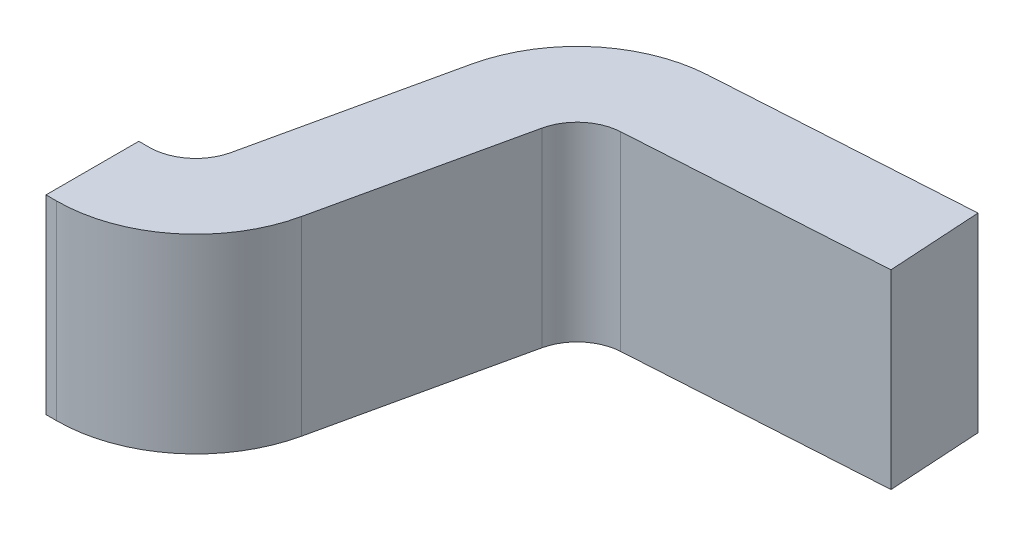
ISO-10303-21;
HEADER;
FILE_DESCRIPTION(('STEP AP214'),'2;1');
FILE_NAME('part.step','',(''),(''),'','','');
FILE_SCHEMA(('AUTOMOTIVE_DESIGN { 1 0 10303 214 1 1 1 1 }'));
ENDSEC;
DATA;
#1=APPLICATION_CONTEXT('core data for automotive mechanical design processes');
#2=APPLICATION_PROTOCOL_DEFINITION('international standard','automotive_design',2000,#1);
#3=PRODUCT_CONTEXT('',#1,'mechanical');
#4=PRODUCT('Part','Part','',(#3));
#5=PRODUCT_RELATED_PRODUCT_CATEGORY('part','',(#4));
#6=PRODUCT_DEFINITION_FORMATION('','',#4);
#7=PRODUCT_DEFINITION_CONTEXT('part definition',#1,'design');
#8=PRODUCT_DEFINITION('design','',#6,#7);
#9=PRODUCT_DEFINITION_SHAPE('','',#8);
#10=(LENGTH_UNIT() NAMED_UNIT(*) SI_UNIT(.MILLI.,.METRE.));
#11=(NAMED_UNIT(*) PLANE_ANGLE_UNIT() SI_UNIT($,.RADIAN.));
#12=(NAMED_UNIT(*) SI_UNIT($,.STERADIAN.) SOLID_ANGLE_UNIT());
#13=UNCERTAINTY_MEASURE_WITH_UNIT(LENGTH_MEASURE(1.E-05),#10,'distance_accuracy_value','');
#14=(GEOMETRIC_REPRESENTATION_CONTEXT(3) GLOBAL_UNCERTAINTY_ASSIGNED_CONTEXT((#13)) GLOBAL_UNIT_ASSIGNED_CONTEXT((#10,
#11,#12)) REPRESENTATION_CONTEXT('',''));
#15=CARTESIAN_POINT('',(0.,0.,0.));
#16=DIRECTION('',(0.,0.,1.));
#17=DIRECTION('',(1.,0.,0.));
#18=AXIS2_PLACEMENT_3D('',#15,#16,#17);
#19=CARTESIAN_POINT('',(1.972711606805,-1.7,0.67));
#20=DIRECTION('',(0.,-1.,0.));
#21=DIRECTION('',(0.,0.,-1.));
#22=AXIS2_PLACEMENT_3D('',#19,#20,#21);
#23=PLANE('',#22);
#24=DIRECTION('',(0.,0.,1.));
#25=VECTOR('',#24,1.);
#26=CARTESIAN_POINT('',(1.95,-1.7,0.97));
#27=LINE('',#26,#25);
#28=CARTESIAN_POINT('',(1.95,-1.7,0.77));
#29=VERTEX_POINT('',#28);
#30=CARTESIAN_POINT('',(1.95,-1.7,0.97));
#31=VERTEX_POINT('',#30);
#32=EDGE_CURVE('E226',#29,#31,#27,.T.);
#33=ORIENTED_EDGE('',*,*,#32,.T.);
#34=DIRECTION('',(1.,0.,0.));
#35=VECTOR('',#34,1.);
#36=CARTESIAN_POINT('',(1.95,-1.7,0.97));
#37=LINE('',#36,#35);
#38=CARTESIAN_POINT('',(1.972711606805,-1.7,0.97));
#39=VERTEX_POINT('',#38);
#40=EDGE_CURVE('E222',#31,#39,#37,.T.);
#41=ORIENTED_EDGE('',*,*,#40,.T.);
#42=CARTESIAN_POINT('',(1.972711606805,-1.7,0.67));
#43=DIRECTION('',(0.,1.,0.));
#44=DIRECTION('',(0.,0.,-1.));
#45=AXIS2_PLACEMENT_3D('',#42,#43,#44);
#46=CIRCLE('',#45,0.3);
#47=CARTESIAN_POINT('',(2.265600408941,-1.7,0.734931884181));
#48=VERTEX_POINT('',#47);
#49=EDGE_CURVE('E235',#39,#48,#46,.T.);
#50=ORIENTED_EDGE('',*,*,#49,.T.);
#51=DIRECTION('',(0.216439613937991,0.,-0.976296007119958));
#52=VECTOR('',#51,1.);
#53=CARTESIAN_POINT('',(2.265600408941,-1.7,0.734931884181));
#54=LINE('',#53,#52);
#55=CARTESIAN_POINT('',(2.359501114109,-1.7,0.311373174877));
#56=VERTEX_POINT('',#55);
#57=EDGE_CURVE('E216',#48,#56,#54,.T.);
#58=ORIENTED_EDGE('',*,*,#57,.T.);
#59=CARTESIAN_POINT('',(2.457130714821,-1.7,0.333017136271));
#60=DIRECTION('',(0.,-1.,0.));
#61=DIRECTION('',(0.,0.,1.));
#62=AXIS2_PLACEMENT_3D('',#59,#60,#61);
#63=CIRCLE('',#62,0.1);
#64=CARTESIAN_POINT('',(2.451025860868,-1.7,0.233203656429));
#65=VERTEX_POINT('',#64);
#66=EDGE_CURVE('E126',#56,#65,#63,.T.);
#67=ORIENTED_EDGE('',*,*,#66,.T.);
#68=DIRECTION('',(0.998134798421867,0.,-0.0610485395348519));
#69=VECTOR('',#68,1.);
#70=CARTESIAN_POINT('',(2.451025860868,-1.7,0.233203656429));
#71=LINE('',#70,#69);
#72=CARTESIAN_POINT('',(3.,-1.7,0.199626959684));
#73=VERTEX_POINT('',#72);
#74=EDGE_CURVE('E159',#65,#73,#71,.T.);
#75=ORIENTED_EDGE('',*,*,#74,.T.);
#76=DIRECTION('',(-0.0610485395348519,0.,-0.998134798421867));
#77=VECTOR('',#76,1.);
#78=CARTESIAN_POINT('',(2.987790292093,-1.7,0.));
#79=LINE('',#78,#77);
#80=CARTESIAN_POINT('',(2.987790292093,-1.7,0.));
#81=VERTEX_POINT('',#80);
#82=EDGE_CURVE('E153',#73,#81,#79,.T.);
#83=ORIENTED_EDGE('',*,*,#82,.T.);
#84=DIRECTION('',(-0.998134798421867,0.,0.0610485395348519));
#85=VECTOR('',#84,1.);
#86=CARTESIAN_POINT('',(2.438816152961,-1.7,0.03357669674417));
#87=LINE('',#86,#85);
#88=CARTESIAN_POINT('',(2.438816152961,-1.7,0.03357669674417));
#89=VERTEX_POINT('',#88);
#90=EDGE_CURVE('E136',#81,#89,#87,.T.);
#91=ORIENTED_EDGE('',*,*,#90,.T.);
#92=CARTESIAN_POINT('',(2.457130714821,-1.7,0.333017136271));
#93=DIRECTION('',(0.,1.,0.));
#94=DIRECTION('',(0.,0.,1.));
#95=AXIS2_PLACEMENT_3D('',#92,#93,#94);
#96=CIRCLE('',#95,0.3);
#97=CARTESIAN_POINT('',(2.164241912685,-1.7,0.268085252089));
#98=VERTEX_POINT('',#97);
#99=EDGE_CURVE('E188',#89,#98,#96,.T.);
#100=ORIENTED_EDGE('',*,*,#99,.T.);
#101=DIRECTION('',(-0.216439613937991,0.,0.976296007119958));
#102=VECTOR('',#101,1.);
#103=CARTESIAN_POINT('',(2.070341207517,-1.7,0.691643961394));
#104=LINE('',#103,#102);
#105=CARTESIAN_POINT('',(2.070341207517,-1.7,0.691643961394));
#106=VERTEX_POINT('',#105);
#107=EDGE_CURVE('E20',#98,#106,#104,.T.);
#108=ORIENTED_EDGE('',*,*,#107,.T.);
#109=CARTESIAN_POINT('',(1.972711606805,-1.7,0.67));
#110=DIRECTION('',(0.,-1.,0.));
#111=DIRECTION('',(0.,0.,-1.));
#112=AXIS2_PLACEMENT_3D('',#109,#110,#111);
#113=CIRCLE('',#112,0.1);
#114=CARTESIAN_POINT('',(1.972711606805,-1.7,0.77));
#115=VERTEX_POINT('',#114);
#116=EDGE_CURVE('E183',#106,#115,#113,.T.);
#117=ORIENTED_EDGE('',*,*,#116,.T.);
#118=DIRECTION('',(-1.,0.,0.));
#119=VECTOR('',#118,1.);
#120=CARTESIAN_POINT('',(1.95,-1.7,0.77));
#121=LINE('',#120,#119);
#122=EDGE_CURVE('E27',#115,#29,#121,.T.);
#123=ORIENTED_EDGE('',*,*,#122,.T.);
#124=EDGE_LOOP('',(#33,#41,#50,#58,#67,#75,#83,#91,#100,#108,#117,#123));
#125=FACE_BOUND('',#124,.T.);
#126=ADVANCED_FACE('F16',(#125),#23,.F.);
#127=CARTESIAN_POINT('',(1.972711606805,-2.11,0.67));
#128=DIRECTION('',(0.,-1.,0.));
#129=DIRECTION('',(0.,0.,-1.));
#130=AXIS2_PLACEMENT_3D('',#127,#128,#129);
#131=PLANE('',#130);
#132=DIRECTION('',(0.,0.,1.));
#133=VECTOR('',#132,1.);
#134=CARTESIAN_POINT('',(1.95,-2.11,0.97));
#135=LINE('',#134,#133);
#136=CARTESIAN_POINT('',(1.95,-2.11,0.77));
#137=VERTEX_POINT('',#136);
#138=CARTESIAN_POINT('',(1.95,-2.11,0.97));
#139=VERTEX_POINT('',#138);
#140=EDGE_CURVE('E205',#137,#139,#135,.T.);
#141=ORIENTED_EDGE('',*,*,#140,.F.);
#142=DIRECTION('',(-1.,0.,0.));
#143=VECTOR('',#142,1.);
#144=CARTESIAN_POINT('',(1.95,-2.11,0.77));
#145=LINE('',#144,#143);
#146=CARTESIAN_POINT('',(1.972711606805,-2.11,0.77));
#147=VERTEX_POINT('',#146);
#148=EDGE_CURVE('E11',#147,#137,#145,.T.);
#149=ORIENTED_EDGE('',*,*,#148,.F.);
#150=CARTESIAN_POINT('',(1.972711606805,-2.11,0.67));
#151=DIRECTION('',(0.,-1.,0.));
#152=DIRECTION('',(0.,0.,-1.));
#153=AXIS2_PLACEMENT_3D('',#150,#151,#152);
#154=CIRCLE('',#153,0.1);
#155=CARTESIAN_POINT('',(2.070341207517,-2.11,0.691643961394));
#156=VERTEX_POINT('',#155);
#157=EDGE_CURVE('E295',#156,#147,#154,.T.);
#158=ORIENTED_EDGE('',*,*,#157,.F.);
#159=DIRECTION('',(-0.216439613937991,0.,0.976296007119958));
#160=VECTOR('',#159,1.);
#161=CARTESIAN_POINT('',(2.070341207517,-2.11,0.691643961394));
#162=LINE('',#161,#160);
#163=CARTESIAN_POINT('',(2.164241912685,-2.11,0.268085252089));
#164=VERTEX_POINT('',#163);
#165=EDGE_CURVE('E175',#164,#156,#162,.T.);
#166=ORIENTED_EDGE('',*,*,#165,.F.);
#167=CARTESIAN_POINT('',(2.457130714821,-2.11,0.333017136271));
#168=DIRECTION('',(0.,1.,0.));
#169=DIRECTION('',(0.,0.,1.));
#170=AXIS2_PLACEMENT_3D('',#167,#168,#169);
#171=CIRCLE('',#170,0.3);
#172=CARTESIAN_POINT('',(2.438816152961,-2.11,0.03357669674417));
#173=VERTEX_POINT('',#172);
#174=EDGE_CURVE('E184',#173,#164,#171,.T.);
#175=ORIENTED_EDGE('',*,*,#174,.F.);
#176=DIRECTION('',(-0.998134798421867,0.,0.0610485395348519));
#177=VECTOR('',#176,1.);
#178=CARTESIAN_POINT('',(2.438816152961,-2.11,0.03357669674417));
#179=LINE('',#178,#177);
#180=CARTESIAN_POINT('',(2.987790292093,-2.11,0.));
#181=VERTEX_POINT('',#180);
#182=EDGE_CURVE('E148',#181,#173,#179,.T.);
#183=ORIENTED_EDGE('',*,*,#182,.F.);
#184=DIRECTION('',(-0.0610485395348519,0.,-0.998134798421867));
#185=VECTOR('',#184,1.);
#186=CARTESIAN_POINT('',(2.987790292093,-2.11,0.));
#187=LINE('',#186,#185);
#188=CARTESIAN_POINT('',(3.,-2.11,0.199626959684));
#189=VERTEX_POINT('',#188);
#190=EDGE_CURVE('E155',#189,#181,#187,.T.);
#191=ORIENTED_EDGE('',*,*,#190,.F.);
#192=DIRECTION('',(0.998134798421867,0.,-0.0610485395348519));
#193=VECTOR('',#192,1.);
#194=CARTESIAN_POINT('',(2.451025860868,-2.11,0.233203656429));
#195=LINE('',#194,#193);
#196=CARTESIAN_POINT('',(2.451025860868,-2.11,0.233203656429));
#197=VERTEX_POINT('',#196);
#198=EDGE_CURVE('E169',#197,#189,#195,.T.);
#199=ORIENTED_EDGE('',*,*,#198,.F.);
#200=CARTESIAN_POINT('',(2.457130714821,-2.11,0.333017136271));
#201=DIRECTION('',(0.,-1.,0.));
#202=DIRECTION('',(0.,0.,1.));
#203=AXIS2_PLACEMENT_3D('',#200,#201,#202);
#204=CIRCLE('',#203,0.1);
#205=CARTESIAN_POINT('',(2.359501114109,-2.11,0.311373174877));
#206=VERTEX_POINT('',#205);
#207=EDGE_CURVE('E115',#206,#197,#204,.T.);
#208=ORIENTED_EDGE('',*,*,#207,.F.);
#209=DIRECTION('',(0.216439613937991,0.,-0.976296007119958));
#210=VECTOR('',#209,1.);
#211=CARTESIAN_POINT('',(2.265600408941,-2.11,0.734931884181));
#212=LINE('',#211,#210);
#213=CARTESIAN_POINT('',(2.265600408941,-2.11,0.734931884181));
#214=VERTEX_POINT('',#213);
#215=EDGE_CURVE('E211',#214,#206,#212,.T.);
#216=ORIENTED_EDGE('',*,*,#215,.F.);
#217=CARTESIAN_POINT('',(1.972711606805,-2.11,0.67));
#218=DIRECTION('',(0.,1.,0.));
#219=DIRECTION('',(0.,0.,-1.));
#220=AXIS2_PLACEMENT_3D('',#217,#218,#219);
#221=CIRCLE('',#220,0.3);
#222=CARTESIAN_POINT('',(1.972711606805,-2.11,0.97));
#223=VERTEX_POINT('',#222);
#224=EDGE_CURVE('E239',#223,#214,#221,.T.);
#225=ORIENTED_EDGE('',*,*,#224,.F.);
#226=DIRECTION('',(1.,0.,0.));
#227=VECTOR('',#226,1.);
#228=CARTESIAN_POINT('',(1.95,-2.11,0.97));
#229=LINE('',#228,#227);
#230=EDGE_CURVE('E217',#139,#223,#229,.T.);
#231=ORIENTED_EDGE('',*,*,#230,.F.);
#232=EDGE_LOOP('',(#141,#149,#158,#166,#175,#183,#191,#199,#208,#216,#225,#231));
#233=FACE_BOUND('',#232,.T.);
#234=ADVANCED_FACE('F284',(#233),#131,.T.);
#235=CARTESIAN_POINT('',(1.95,-2.11,0.77));
#236=DIRECTION('',(0.,0.,1.));
#237=DIRECTION('',(1.,0.,0.));
#238=AXIS2_PLACEMENT_3D('',#235,#236,#237);
#239=PLANE('',#238);
#240=ORIENTED_EDGE('',*,*,#122,.F.);
#241=DIRECTION('',(0.,1.,0.));
#242=VECTOR('',#241,1.);
#243=CARTESIAN_POINT('',(1.972711606805,-2.11,0.77));
#244=LINE('',#243,#242);
#245=EDGE_CURVE('E173',#147,#115,#244,.T.);
#246=ORIENTED_EDGE('',*,*,#245,.F.);
#247=ORIENTED_EDGE('',*,*,#148,.T.);
#248=DIRECTION('',(0.,1.,0.));
#249=VECTOR('',#248,1.);
#250=CARTESIAN_POINT('',(1.95,-2.11,0.77));
#251=LINE('',#250,#249);
#252=EDGE_CURVE('E210',#137,#29,#251,.T.);
#253=ORIENTED_EDGE('',*,*,#252,.T.);
#254=EDGE_LOOP('',(#240,#246,#247,#253));
#255=FACE_BOUND('',#254,.T.);
#256=ADVANCED_FACE('F289',(#255),#239,.F.);
#257=CARTESIAN_POINT('',(1.972711606805,-2.11,0.67));
#258=DIRECTION('',(0.,-1.,0.));
#259=DIRECTION('',(0.,0.,1.));
#260=AXIS2_PLACEMENT_3D('',#257,#258,#259);
#261=CYLINDRICAL_SURFACE('',#260,0.1);
#262=ORIENTED_EDGE('',*,*,#116,.F.);
#263=DIRECTION('',(0.,1.,0.));
#264=VECTOR('',#263,1.);
#265=CARTESIAN_POINT('',(2.070341207517,-2.11,0.691643961394));
#266=LINE('',#265,#264);
#267=EDGE_CURVE('E179',#156,#106,#266,.T.);
#268=ORIENTED_EDGE('',*,*,#267,.F.);
#269=ORIENTED_EDGE('',*,*,#157,.T.);
#270=ORIENTED_EDGE('',*,*,#245,.T.);
#271=EDGE_LOOP('',(#262,#268,#269,#270));
#272=FACE_BOUND('',#271,.T.);
#273=ADVANCED_FACE('F297',(#272),#261,.F.);
#274=CARTESIAN_POINT('',(2.070341207517,-2.11,0.691643961394));
#275=DIRECTION('',(0.976296007119958,0.,0.216439613937991));
#276=DIRECTION('',(0.,-1.,0.));
#277=AXIS2_PLACEMENT_3D('',#274,#275,#276);
#278=PLANE('',#277);
#279=ORIENTED_EDGE('',*,*,#107,.F.);
#280=DIRECTION('',(0.,1.,0.));
#281=VECTOR('',#280,1.);
#282=CARTESIAN_POINT('',(2.164241912685,-2.11,0.268085252089));
#283=LINE('',#282,#281);
#284=EDGE_CURVE('E187',#164,#98,#283,.T.);
#285=ORIENTED_EDGE('',*,*,#284,.F.);
#286=ORIENTED_EDGE('',*,*,#165,.T.);
#287=ORIENTED_EDGE('',*,*,#267,.T.);
#288=EDGE_LOOP('',(#279,#285,#286,#287));
#289=FACE_BOUND('',#288,.T.);
#290=ADVANCED_FACE('F428',(#289),#278,.F.);
#291=CARTESIAN_POINT('',(2.457130714821,-2.11,0.333017136271));
#292=DIRECTION('',(0.,-1.,0.));
#293=DIRECTION('',(0.,0.,1.));
#294=AXIS2_PLACEMENT_3D('',#291,#292,#293);
#295=CYLINDRICAL_SURFACE('',#294,0.3);
#296=ORIENTED_EDGE('',*,*,#99,.F.);
#297=DIRECTION('',(0.,1.,0.));
#298=VECTOR('',#297,1.);
#299=CARTESIAN_POINT('',(2.438816152961,-2.11,0.03357669674417));
#300=LINE('',#299,#298);
#301=EDGE_CURVE('E143',#173,#89,#300,.T.);
#302=ORIENTED_EDGE('',*,*,#301,.F.);
#303=ORIENTED_EDGE('',*,*,#174,.T.);
#304=ORIENTED_EDGE('',*,*,#284,.T.);
#305=EDGE_LOOP('',(#296,#302,#303,#304));
#306=FACE_BOUND('',#305,.T.);
#307=ADVANCED_FACE('F423',(#306),#295,.T.);
#308=CARTESIAN_POINT('',(2.438816152961,-2.11,0.03357669674417));
#309=DIRECTION('',(0.0610485395348519,0.,0.998134798421867));
#310=DIRECTION('',(0.,-1.,0.));
#311=AXIS2_PLACEMENT_3D('',#308,#309,#310);
#312=PLANE('',#311);
#313=ORIENTED_EDGE('',*,*,#90,.F.);
#314=DIRECTION('',(0.,1.,0.));
#315=VECTOR('',#314,1.);
#316=CARTESIAN_POINT('',(2.987790292093,-2.11,0.));
#317=LINE('',#316,#315);
#318=EDGE_CURVE('E140',#181,#81,#317,.T.);
#319=ORIENTED_EDGE('',*,*,#318,.F.);
#320=ORIENTED_EDGE('',*,*,#182,.T.);
#321=ORIENTED_EDGE('',*,*,#301,.T.);
#322=EDGE_LOOP('',(#313,#319,#320,#321));
#323=FACE_BOUND('',#322,.T.);
#324=ADVANCED_FACE('F138',(#323),#312,.F.);
#325=CARTESIAN_POINT('',(2.987790292093,-2.11,0.));
#326=DIRECTION('',(-0.998134798421867,0.,0.0610485395348519));
#327=DIRECTION('',(0.,1.,0.));
#328=AXIS2_PLACEMENT_3D('',#325,#326,#327);
#329=PLANE('',#328);
#330=ORIENTED_EDGE('',*,*,#82,.F.);
#331=DIRECTION('',(0.,1.,0.));
#332=VECTOR('',#331,1.);
#333=CARTESIAN_POINT('',(3.,-2.11,0.199626959684));
#334=LINE('',#333,#332);
#335=EDGE_CURVE('E161',#189,#73,#334,.T.);
#336=ORIENTED_EDGE('',*,*,#335,.F.);
#337=ORIENTED_EDGE('',*,*,#190,.T.);
#338=ORIENTED_EDGE('',*,*,#318,.T.);
#339=EDGE_LOOP('',(#330,#336,#337,#338));
#340=FACE_BOUND('',#339,.T.);
#341=ADVANCED_FACE('F151',(#340),#329,.F.);
#342=CARTESIAN_POINT('',(2.451025860868,-2.11,0.233203656429));
#343=DIRECTION('',(-0.0610485395348519,0.,-0.998134798421867));
#344=DIRECTION('',(-0.998134798421867,0.,0.0610485395348519));
#345=AXIS2_PLACEMENT_3D('',#342,#343,#344);
#346=PLANE('',#345);
#347=ORIENTED_EDGE('',*,*,#74,.F.);
#348=DIRECTION('',(0.,1.,0.));
#349=VECTOR('',#348,1.);
#350=CARTESIAN_POINT('',(2.451025860868,-2.11,0.233203656429));
#351=LINE('',#350,#349);
#352=EDGE_CURVE('E229',#197,#65,#351,.T.);
#353=ORIENTED_EDGE('',*,*,#352,.F.);
#354=ORIENTED_EDGE('',*,*,#198,.T.);
#355=ORIENTED_EDGE('',*,*,#335,.T.);
#356=EDGE_LOOP('',(#347,#353,#354,#355));
#357=FACE_BOUND('',#356,.T.);
#358=ADVANCED_FACE('F353',(#357),#346,.F.);
#359=CARTESIAN_POINT('',(2.457130714821,-2.11,0.333017136271));
#360=DIRECTION('',(0.,-1.,0.));
#361=DIRECTION('',(0.,0.,1.));
#362=AXIS2_PLACEMENT_3D('',#359,#360,#361);
#363=CYLINDRICAL_SURFACE('',#362,0.1);
#364=ORIENTED_EDGE('',*,*,#66,.F.);
#365=DIRECTION('',(0.,1.,0.));
#366=VECTOR('',#365,1.);
#367=CARTESIAN_POINT('',(2.359501114109,-2.11,0.311373174877));
#368=LINE('',#367,#366);
#369=EDGE_CURVE('E215',#206,#56,#368,.T.);
#370=ORIENTED_EDGE('',*,*,#369,.F.);
#371=ORIENTED_EDGE('',*,*,#207,.T.);
#372=ORIENTED_EDGE('',*,*,#352,.T.);
#373=EDGE_LOOP('',(#364,#370,#371,#372));
#374=FACE_BOUND('',#373,.T.);
#375=ADVANCED_FACE('F359',(#374),#363,.F.);
#376=CARTESIAN_POINT('',(2.265600408941,-2.11,0.734931884181));
#377=DIRECTION('',(-0.976296007119958,0.,-0.216439613937991));
#378=DIRECTION('',(-0.216439613937991,0.,0.976296007119958));
#379=AXIS2_PLACEMENT_3D('',#376,#377,#378);
#380=PLANE('',#379);
#381=ORIENTED_EDGE('',*,*,#57,.F.);
#382=DIRECTION('',(0.,1.,0.));
#383=VECTOR('',#382,1.);
#384=CARTESIAN_POINT('',(2.265600408941,-2.11,0.734931884181));
#385=LINE('',#384,#383);
#386=EDGE_CURVE('E242',#214,#48,#385,.T.);
#387=ORIENTED_EDGE('',*,*,#386,.F.);
#388=ORIENTED_EDGE('',*,*,#215,.T.);
#389=ORIENTED_EDGE('',*,*,#369,.T.);
#390=EDGE_LOOP('',(#381,#387,#388,#389));
#391=FACE_BOUND('',#390,.T.);
#392=ADVANCED_FACE('F282',(#391),#380,.F.);
#393=CARTESIAN_POINT('',(1.972711606805,-2.11,0.67));
#394=DIRECTION('',(0.,-1.,0.));
#395=DIRECTION('',(0.,0.,1.));
#396=AXIS2_PLACEMENT_3D('',#393,#394,#395);
#397=CYLINDRICAL_SURFACE('',#396,0.3);
#398=ORIENTED_EDGE('',*,*,#49,.F.);
#399=DIRECTION('',(0.,1.,0.));
#400=VECTOR('',#399,1.);
#401=CARTESIAN_POINT('',(1.972711606805,-2.11,0.97));
#402=LINE('',#401,#400);
#403=EDGE_CURVE('E221',#223,#39,#402,.T.);
#404=ORIENTED_EDGE('',*,*,#403,.F.);
#405=ORIENTED_EDGE('',*,*,#224,.T.);
#406=ORIENTED_EDGE('',*,*,#386,.T.);
#407=EDGE_LOOP('',(#398,#404,#405,#406));
#408=FACE_BOUND('',#407,.T.);
#409=ADVANCED_FACE('F283',(#408),#397,.T.);
#410=CARTESIAN_POINT('',(1.95,-2.11,0.97));
#411=DIRECTION('',(0.,0.,-1.));
#412=DIRECTION('',(0.,-1.,0.));
#413=AXIS2_PLACEMENT_3D('',#410,#411,#412);
#414=PLANE('',#413);
#415=ORIENTED_EDGE('',*,*,#40,.F.);
#416=DIRECTION('',(0.,1.,0.));
#417=VECTOR('',#416,1.);
#418=CARTESIAN_POINT('',(1.95,-2.11,0.97));
#419=LINE('',#418,#417);
#420=EDGE_CURVE('E209',#139,#31,#419,.T.);
#421=ORIENTED_EDGE('',*,*,#420,.F.);
#422=ORIENTED_EDGE('',*,*,#230,.T.);
#423=ORIENTED_EDGE('',*,*,#403,.T.);
#424=EDGE_LOOP('',(#415,#421,#422,#423));
#425=FACE_BOUND('',#424,.T.);
#426=ADVANCED_FACE('F18',(#425),#414,.F.);
#427=CARTESIAN_POINT('',(1.95,-2.11,0.97));
#428=DIRECTION('',(1.,0.,0.));
#429=DIRECTION('',(0.,1.,0.));
#430=AXIS2_PLACEMENT_3D('',#427,#428,#429);
#431=PLANE('',#430);
#432=ORIENTED_EDGE('',*,*,#32,.F.);
#433=ORIENTED_EDGE('',*,*,#252,.F.);
#434=ORIENTED_EDGE('',*,*,#140,.T.);
#435=ORIENTED_EDGE('',*,*,#420,.T.);
#436=EDGE_LOOP('',(#432,#433,#434,#435));
#437=FACE_BOUND('',#436,.T.);
#438=ADVANCED_FACE('F287',(#437),#431,.F.);
#439=CLOSED_SHELL('',(#126,#234,#256,#273,#290,#307,#324,#341,#358,#375,#392,#409,#426,#438));
#440=MANIFOLD_SOLID_BREP('B1',#439);
#441=ADVANCED_BREP_SHAPE_REPRESENTATION('',(#18,#440),#14);
#442=SHAPE_DEFINITION_REPRESENTATION(#9,#441);
ENDSEC;
END-ISO-10303-21;
